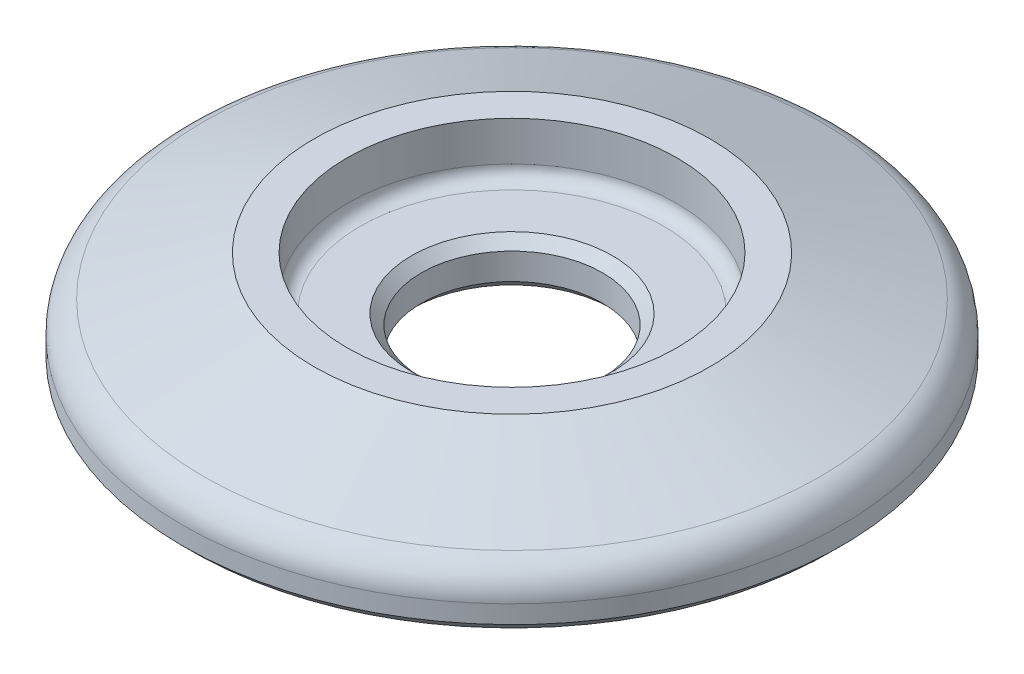
ISO-10303-21;
HEADER;
FILE_DESCRIPTION(('STEP AP214'),'2;1');
FILE_NAME('part.step','',(''),(''),'','','');
FILE_SCHEMA(('AUTOMOTIVE_DESIGN { 1 0 10303 214 1 1 1 1 }'));
ENDSEC;
DATA;
#1=APPLICATION_CONTEXT('core data for automotive mechanical design processes');
#2=APPLICATION_PROTOCOL_DEFINITION('international standard','automotive_design',2000,#1);
#3=PRODUCT_CONTEXT('',#1,'mechanical');
#4=PRODUCT('Part','Part','',(#3));
#5=PRODUCT_RELATED_PRODUCT_CATEGORY('part','',(#4));
#6=PRODUCT_DEFINITION_FORMATION('','',#4);
#7=PRODUCT_DEFINITION_CONTEXT('part definition',#1,'design');
#8=PRODUCT_DEFINITION('design','',#6,#7);
#9=PRODUCT_DEFINITION_SHAPE('','',#8);
#10=(LENGTH_UNIT() NAMED_UNIT(*) SI_UNIT(.MILLI.,.METRE.));
#11=(NAMED_UNIT(*) PLANE_ANGLE_UNIT() SI_UNIT($,.RADIAN.));
#12=(NAMED_UNIT(*) SI_UNIT($,.STERADIAN.) SOLID_ANGLE_UNIT());
#13=UNCERTAINTY_MEASURE_WITH_UNIT(LENGTH_MEASURE(1.E-05),#10,'distance_accuracy_value','');
#14=(GEOMETRIC_REPRESENTATION_CONTEXT(3) GLOBAL_UNCERTAINTY_ASSIGNED_CONTEXT((#13)) GLOBAL_UNIT_ASSIGNED_CONTEXT((#10,
#11,#12)) REPRESENTATION_CONTEXT('',''));
#15=CARTESIAN_POINT('',(0.,0.,0.));
#16=DIRECTION('',(0.,0.,1.));
#17=DIRECTION('',(1.,0.,0.));
#18=AXIS2_PLACEMENT_3D('',#15,#16,#17);
#19=CARTESIAN_POINT('',(10.,0.,0.));
#20=DIRECTION('',(0.,-1.,0.));
#21=DIRECTION('',(0.,0.,-1.));
#22=AXIS2_PLACEMENT_3D('',#19,#20,#21);
#23=PLANE('',#22);
#24=CARTESIAN_POINT('',(0.,0.,0.));
#25=DIRECTION('',(0.,-1.,0.));
#26=DIRECTION('',(0.,0.,-1.));
#27=AXIS2_PLACEMENT_3D('',#24,#25,#26);
#28=CIRCLE('',#27,3.05);
#29=CARTESIAN_POINT('',(0.,0.,-3.05));
#30=VERTEX_POINT('',#29);
#31=EDGE_CURVE('E46',#30,#30,#28,.F.);
#32=ORIENTED_EDGE('',*,*,#31,.T.);
#33=EDGE_LOOP('',(#32));
#34=FACE_BOUND('',#33,.T.);
#35=CARTESIAN_POINT('',(0.,0.,0.));
#36=DIRECTION('',(0.,-1.,0.));
#37=DIRECTION('',(0.,0.,-1.));
#38=AXIS2_PLACEMENT_3D('',#35,#36,#37);
#39=CIRCLE('',#38,9.70000000000001);
#40=CARTESIAN_POINT('',(0.,0.,-9.70000000000001));
#41=VERTEX_POINT('',#40);
#42=EDGE_CURVE('E50',#41,#41,#39,.T.);
#43=ORIENTED_EDGE('',*,*,#42,.T.);
#44=EDGE_LOOP('',(#43));
#45=FACE_BOUND('',#44,.T.);
#46=ADVANCED_FACE('F38',(#34,#45),#23,.T.);
#47=CARTESIAN_POINT('',(0.,0.,0.));
#48=DIRECTION('',(0.,-1.,0.));
#49=DIRECTION('',(0.,0.,-1.));
#50=AXIS2_PLACEMENT_3D('',#47,#48,#49);
#51=CYLINDRICAL_SURFACE('',#50,2.75);
#52=CARTESIAN_POINT('',(0.,1.1,0.));
#53=DIRECTION('',(0.,1.,0.));
#54=DIRECTION('',(0.,0.,1.));
#55=AXIS2_PLACEMENT_3D('',#52,#53,#54);
#56=CIRCLE('',#55,2.75);
#57=CARTESIAN_POINT('',(0.,1.1,2.75));
#58=VERTEX_POINT('',#57);
#59=EDGE_CURVE('E54',#58,#58,#56,.T.);
#60=ORIENTED_EDGE('',*,*,#59,.T.);
#61=EDGE_LOOP('',(#60));
#62=FACE_BOUND('',#61,.T.);
#63=CARTESIAN_POINT('',(0.,0.299999999999999,0.));
#64=DIRECTION('',(0.,-1.,0.));
#65=DIRECTION('',(0.,0.,-1.));
#66=AXIS2_PLACEMENT_3D('',#63,#64,#65);
#67=CIRCLE('',#66,2.75);
#68=CARTESIAN_POINT('',(0.,0.299999999999999,-2.75));
#69=VERTEX_POINT('',#68);
#70=EDGE_CURVE('E59',#69,#69,#67,.T.);
#71=ORIENTED_EDGE('',*,*,#70,.T.);
#72=EDGE_LOOP('',(#71));
#73=FACE_BOUND('',#72,.T.);
#74=ADVANCED_FACE('F102',(#62,#73),#51,.F.);
#75=CARTESIAN_POINT('',(2.75,1.4,0.));
#76=DIRECTION('',(0.,1.,0.));
#77=DIRECTION('',(0.,0.,1.));
#78=AXIS2_PLACEMENT_3D('',#75,#76,#77);
#79=PLANE('',#78);
#80=CARTESIAN_POINT('',(0.,1.4,0.));
#81=DIRECTION('',(0.,1.,0.));
#82=DIRECTION('',(0.,0.,1.));
#83=AXIS2_PLACEMENT_3D('',#80,#81,#82);
#84=CIRCLE('',#83,3.05);
#85=CARTESIAN_POINT('',(0.,1.4,3.05));
#86=VERTEX_POINT('',#85);
#87=EDGE_CURVE('E62',#86,#86,#84,.F.);
#88=ORIENTED_EDGE('',*,*,#87,.T.);
#89=EDGE_LOOP('',(#88));
#90=FACE_BOUND('',#89,.T.);
#91=CARTESIAN_POINT('',(0.,1.4,0.));
#92=DIRECTION('',(0.,1.,0.));
#93=DIRECTION('',(0.,0.,1.));
#94=AXIS2_PLACEMENT_3D('',#91,#92,#93);
#95=CIRCLE('',#94,4.6);
#96=CARTESIAN_POINT('',(0.,1.4,4.6));
#97=VERTEX_POINT('',#96);
#98=EDGE_CURVE('E65',#97,#97,#95,.T.);
#99=ORIENTED_EDGE('',*,*,#98,.T.);
#100=EDGE_LOOP('',(#99));
#101=FACE_BOUND('',#100,.T.);
#102=ADVANCED_FACE('F98',(#90,#101),#79,.T.);
#103=CARTESIAN_POINT('',(0.,0.,0.));
#104=DIRECTION('',(0.,-1.,0.));
#105=DIRECTION('',(0.,0.,-1.));
#106=AXIS2_PLACEMENT_3D('',#103,#104,#105);
#107=CYLINDRICAL_SURFACE('',#106,5.);
#108=CARTESIAN_POINT('',(0.,1.8,0.));
#109=DIRECTION('',(0.,1.,0.));
#110=DIRECTION('',(0.,0.,1.));
#111=AXIS2_PLACEMENT_3D('',#108,#109,#110);
#112=CIRCLE('',#111,5.);
#113=CARTESIAN_POINT('',(0.,1.8,5.));
#114=VERTEX_POINT('',#113);
#115=EDGE_CURVE('E68',#114,#114,#112,.F.);
#116=ORIENTED_EDGE('',*,*,#115,.T.);
#117=EDGE_LOOP('',(#116));
#118=FACE_BOUND('',#117,.T.);
#119=CARTESIAN_POINT('',(0.,3.,0.));
#120=DIRECTION('',(0.,-1.,0.));
#121=DIRECTION('',(0.,0.,-1.));
#122=AXIS2_PLACEMENT_3D('',#119,#120,#121);
#123=CIRCLE('',#122,5.);
#124=CARTESIAN_POINT('',(0.,3.,-5.));
#125=VERTEX_POINT('',#124);
#126=EDGE_CURVE('E77',#125,#125,#123,.T.);
#127=ORIENTED_EDGE('',*,*,#126,.F.);
#128=EDGE_LOOP('',(#127));
#129=FACE_BOUND('',#128,.T.);
#130=ADVANCED_FACE('F88',(#118,#129),#107,.F.);
#131=CARTESIAN_POINT('',(5.,3.,0.));
#132=DIRECTION('',(0.,1.,0.));
#133=DIRECTION('',(0.,0.,1.));
#134=AXIS2_PLACEMENT_3D('',#131,#132,#133);
#135=PLANE('',#134);
#136=ORIENTED_EDGE('',*,*,#126,.T.);
#137=EDGE_LOOP('',(#136));
#138=FACE_BOUND('',#137,.T.);
#139=CARTESIAN_POINT('',(0.,3.,0.));
#140=DIRECTION('',(0.,-1.,0.));
#141=DIRECTION('',(0.,0.,-1.));
#142=AXIS2_PLACEMENT_3D('',#139,#140,#141);
#143=CIRCLE('',#142,6.);
#144=CARTESIAN_POINT('',(0.,3.,-6.));
#145=VERTEX_POINT('',#144);
#146=EDGE_CURVE('E80',#145,#145,#143,.T.);
#147=ORIENTED_EDGE('',*,*,#146,.F.);
#148=EDGE_LOOP('',(#147));
#149=FACE_BOUND('',#148,.T.);
#150=ADVANCED_FACE('F86',(#138,#149),#135,.T.);
#151=CARTESIAN_POINT('',(0.,1.54411906293522,0.));
#152=DIRECTION('',(0.,-1.,0.));
#153=DIRECTION('',(0.,0.,-1.));
#154=AXIS2_PLACEMENT_3D('',#151,#152,#153);
#155=CONICAL_SURFACE('',#154,10.,1.22173047639604);
#156=CARTESIAN_POINT('',(0.,1.78360414551141,0.));
#157=DIRECTION('',(0.,1.,0.));
#158=DIRECTION('',(0.,0.,1.));
#159=AXIS2_PLACEMENT_3D('',#156,#157,#158);
#160=CIRCLE('',#159,9.34202014332566);
#161=CARTESIAN_POINT('',(0.,1.78360414551141,9.34202014332566));
#162=VERTEX_POINT('',#161);
#163=EDGE_CURVE('E71',#162,#162,#160,.T.);
#164=ORIENTED_EDGE('',*,*,#163,.T.);
#165=EDGE_LOOP('',(#164));
#166=FACE_BOUND('',#165,.T.);
#167=ORIENTED_EDGE('',*,*,#146,.T.);
#168=EDGE_LOOP('',(#167));
#169=FACE_BOUND('',#168,.T.);
#170=ADVANCED_FACE('F84',(#166,#169),#155,.T.);
#171=CARTESIAN_POINT('',(0.,0.,0.));
#172=DIRECTION('',(0.,-1.,0.));
#173=DIRECTION('',(0.,0.,-1.));
#174=AXIS2_PLACEMENT_3D('',#171,#172,#173);
#175=CYLINDRICAL_SURFACE('',#174,10.);
#176=CARTESIAN_POINT('',(0.,0.299999999999994,0.));
#177=DIRECTION('',(0.,-1.,0.));
#178=DIRECTION('',(0.,0.,-1.));
#179=AXIS2_PLACEMENT_3D('',#176,#177,#178);
#180=CIRCLE('',#179,10.);
#181=CARTESIAN_POINT('',(0.,0.299999999999994,-10.));
#182=VERTEX_POINT('',#181);
#183=EDGE_CURVE('E10',#182,#182,#180,.F.);
#184=ORIENTED_EDGE('',*,*,#183,.T.);
#185=EDGE_LOOP('',(#184));
#186=FACE_BOUND('',#185,.T.);
#187=CARTESIAN_POINT('',(0.,0.843911524725504,0.));
#188=DIRECTION('',(0.,1.,0.));
#189=DIRECTION('',(0.,0.,1.));
#190=AXIS2_PLACEMENT_3D('',#187,#188,#189);
#191=CIRCLE('',#190,10.);
#192=CARTESIAN_POINT('',(0.,0.843911524725504,10.));
#193=VERTEX_POINT('',#192);
#194=EDGE_CURVE('E74',#193,#193,#191,.F.);
#195=ORIENTED_EDGE('',*,*,#194,.T.);
#196=EDGE_LOOP('',(#195));
#197=FACE_BOUND('',#196,.T.);
#198=ADVANCED_FACE('F95',(#186,#197),#175,.T.);
#199=CARTESIAN_POINT('',(0.,0.843911524725504,0.));
#200=DIRECTION('',(0.,1.,0.));
#201=DIRECTION('',(0.,0.,1.));
#202=AXIS2_PLACEMENT_3D('',#199,#200,#201);
#203=TOROIDAL_SURFACE('',#202,9.,1.);
#204=ORIENTED_EDGE('',*,*,#163,.F.);
#205=EDGE_LOOP('',(#204));
#206=FACE_BOUND('',#205,.T.);
#207=ORIENTED_EDGE('',*,*,#194,.F.);
#208=EDGE_LOOP('',(#207));
#209=FACE_BOUND('',#208,.T.);
#210=ADVANCED_FACE('F112',(#206,#209),#203,.T.);
#211=CARTESIAN_POINT('',(0.,1.8,0.));
#212=DIRECTION('',(0.,1.,0.));
#213=DIRECTION('',(0.,0.,1.));
#214=AXIS2_PLACEMENT_3D('',#211,#212,#213);
#215=TOROIDAL_SURFACE('',#214,4.6,0.4);
#216=ORIENTED_EDGE('',*,*,#98,.F.);
#217=EDGE_LOOP('',(#216));
#218=FACE_BOUND('',#217,.T.);
#219=ORIENTED_EDGE('',*,*,#115,.F.);
#220=EDGE_LOOP('',(#219));
#221=FACE_BOUND('',#220,.T.);
#222=ADVANCED_FACE('F115',(#218,#221),#215,.F.);
#223=CARTESIAN_POINT('',(0.,1.4,0.));
#224=DIRECTION('',(0.,1.,0.));
#225=DIRECTION('',(0.,0.,1.));
#226=AXIS2_PLACEMENT_3D('',#223,#224,#225);
#227=CONICAL_SURFACE('',#226,3.05,0.785398163397447);
#228=ORIENTED_EDGE('',*,*,#59,.F.);
#229=EDGE_LOOP('',(#228));
#230=FACE_BOUND('',#229,.T.);
#231=ORIENTED_EDGE('',*,*,#87,.F.);
#232=EDGE_LOOP('',(#231));
#233=FACE_BOUND('',#232,.T.);
#234=ADVANCED_FACE('F119',(#230,#233),#227,.F.);
#235=CARTESIAN_POINT('',(0.,0.299999999999999,0.));
#236=DIRECTION('',(0.,-1.,0.));
#237=DIRECTION('',(0.,0.,-1.));
#238=AXIS2_PLACEMENT_3D('',#235,#236,#237);
#239=CONICAL_SURFACE('',#238,2.75,0.78539816339745);
#240=ORIENTED_EDGE('',*,*,#31,.F.);
#241=EDGE_LOOP('',(#240));
#242=FACE_BOUND('',#241,.T.);
#243=ORIENTED_EDGE('',*,*,#70,.F.);
#244=EDGE_LOOP('',(#243));
#245=FACE_BOUND('',#244,.T.);
#246=ADVANCED_FACE('F126',(#242,#245),#239,.F.);
#247=CARTESIAN_POINT('',(0.,0.,0.));
#248=DIRECTION('',(0.,1.,0.));
#249=DIRECTION('',(0.,0.,1.));
#250=AXIS2_PLACEMENT_3D('',#247,#248,#249);
#251=CONICAL_SURFACE('',#250,9.70000000000001,0.785398163397445);
#252=ORIENTED_EDGE('',*,*,#183,.F.);
#253=EDGE_LOOP('',(#252));
#254=FACE_BOUND('',#253,.T.);
#255=ORIENTED_EDGE('',*,*,#42,.F.);
#256=EDGE_LOOP('',(#255));
#257=FACE_BOUND('',#256,.T.);
#258=ADVANCED_FACE('F41',(#254,#257),#251,.T.);
#259=CLOSED_SHELL('',(#46,#74,#102,#130,#150,#170,#198,#210,#222,#234,#246,#258));
#260=MANIFOLD_SOLID_BREP('B2',#259);
#261=ADVANCED_BREP_SHAPE_REPRESENTATION('',(#18,#260),#14);
#262=SHAPE_DEFINITION_REPRESENTATION(#9,#261);
ENDSEC;
END-ISO-10303-21;
